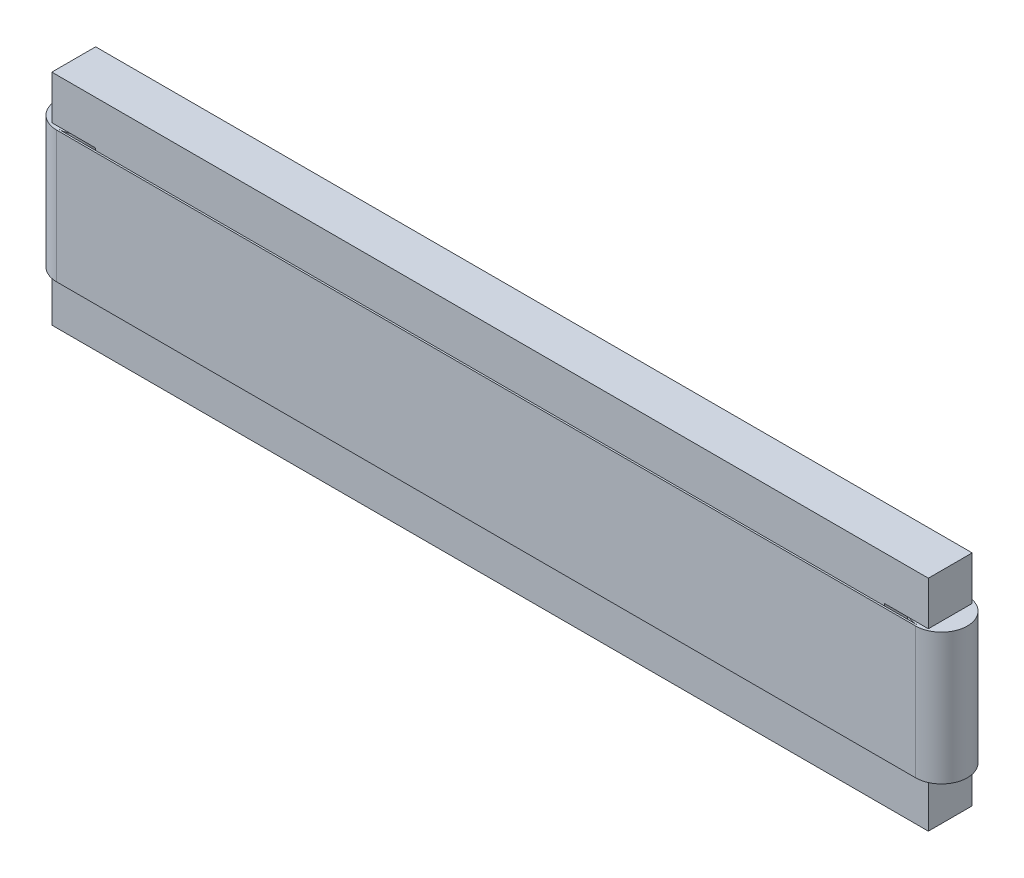
ISO-10303-21;
HEADER;
FILE_DESCRIPTION(('STEP AP214'),'2;1');
FILE_NAME('part.step','',(''),(''),'','','');
FILE_SCHEMA(('AUTOMOTIVE_DESIGN { 1 0 10303 214 1 1 1 1 }'));
ENDSEC;
DATA;
#1=APPLICATION_CONTEXT('core data for automotive mechanical design processes');
#2=APPLICATION_PROTOCOL_DEFINITION('international standard','automotive_design',2000,#1);
#3=PRODUCT_CONTEXT('',#1,'mechanical');
#4=PRODUCT('Part','Part','',(#3));
#5=PRODUCT_RELATED_PRODUCT_CATEGORY('part','',(#4));
#6=PRODUCT_DEFINITION_FORMATION('','',#4);
#7=PRODUCT_DEFINITION_CONTEXT('part definition',#1,'design');
#8=PRODUCT_DEFINITION('design','',#6,#7);
#9=PRODUCT_DEFINITION_SHAPE('','',#8);
#10=(LENGTH_UNIT() NAMED_UNIT(*) SI_UNIT(.MILLI.,.METRE.));
#11=(NAMED_UNIT(*) PLANE_ANGLE_UNIT() SI_UNIT($,.RADIAN.));
#12=(NAMED_UNIT(*) SI_UNIT($,.STERADIAN.) SOLID_ANGLE_UNIT());
#13=UNCERTAINTY_MEASURE_WITH_UNIT(LENGTH_MEASURE(1.E-05),#10,'distance_accuracy_value','');
#14=(GEOMETRIC_REPRESENTATION_CONTEXT(3) GLOBAL_UNCERTAINTY_ASSIGNED_CONTEXT((#13)) GLOBAL_UNIT_ASSIGNED_CONTEXT((#10,
#11,#12)) REPRESENTATION_CONTEXT('',''));
#15=CARTESIAN_POINT('',(0.,0.,0.));
#16=DIRECTION('',(0.,0.,1.));
#17=DIRECTION('',(1.,0.,0.));
#18=AXIS2_PLACEMENT_3D('',#15,#16,#17);
#19=CARTESIAN_POINT('',(-490.,50.0000000000004,25.));
#20=DIRECTION('',(0.,1.,0.));
#21=DIRECTION('',(-1.,0.,0.));
#22=AXIS2_PLACEMENT_3D('',#19,#20,#21);
#23=CYLINDRICAL_SURFACE('',#22,27.5);
#24=DIRECTION('',(0.,-1.,0.));
#25=VECTOR('',#24,1.);
#26=CARTESIAN_POINT('',(-490.,200.,52.5));
#27=LINE('',#26,#25);
#28=CARTESIAN_POINT('',(-490.,200.,52.5));
#29=VERTEX_POINT('',#28);
#30=CARTESIAN_POINT('',(-490.,50.0000000000004,52.5));
#31=VERTEX_POINT('',#30);
#32=EDGE_CURVE('E62',#29,#31,#27,.T.);
#33=ORIENTED_EDGE('',*,*,#32,.T.);
#34=CARTESIAN_POINT('',(-490.,50.0000000000004,25.));
#35=DIRECTION('',(0.,-1.,0.));
#36=DIRECTION('',(1.,0.,0.));
#37=AXIS2_PLACEMENT_3D('',#34,#35,#36);
#38=CIRCLE('',#37,27.5);
#39=CARTESIAN_POINT('',(-478.54356076261,49.9999999999999,50.));
#40=VERTEX_POINT('',#39);
#41=EDGE_CURVE('E304',#40,#31,#38,.T.);
#42=ORIENTED_EDGE('',*,*,#41,.F.);
#43=CARTESIAN_POINT('',(-478.54356076261,49.9999999999999,0.));
#44=VERTEX_POINT('',#43);
#45=EDGE_CURVE('E307',#44,#40,#38,.T.);
#46=ORIENTED_EDGE('',*,*,#45,.F.);
#47=CARTESIAN_POINT('',(-490.,50.0000000000004,-2.50000000000003));
#48=VERTEX_POINT('',#47);
#49=EDGE_CURVE('E55',#48,#44,#38,.T.);
#50=ORIENTED_EDGE('',*,*,#49,.F.);
#51=DIRECTION('',(0.,-1.,0.));
#52=VECTOR('',#51,1.);
#53=CARTESIAN_POINT('',(-490.,200.,-2.50000000000003));
#54=LINE('',#53,#52);
#55=CARTESIAN_POINT('',(-490.,200.,-2.50000000000003));
#56=VERTEX_POINT('',#55);
#57=EDGE_CURVE('E215',#56,#48,#54,.T.);
#58=ORIENTED_EDGE('',*,*,#57,.F.);
#59=CARTESIAN_POINT('',(-490.,200.,25.));
#60=DIRECTION('',(0.,-1.,0.));
#61=DIRECTION('',(1.,0.,0.));
#62=AXIS2_PLACEMENT_3D('',#59,#60,#61);
#63=CIRCLE('',#62,27.5);
#64=CARTESIAN_POINT('',(-478.54356076261,200.,0.));
#65=VERTEX_POINT('',#64);
#66=EDGE_CURVE('E201',#56,#65,#63,.T.);
#67=ORIENTED_EDGE('',*,*,#66,.T.);
#68=CARTESIAN_POINT('',(-478.54356076261,200.,50.));
#69=VERTEX_POINT('',#68);
#70=EDGE_CURVE('E213',#65,#69,#63,.T.);
#71=ORIENTED_EDGE('',*,*,#70,.T.);
#72=EDGE_CURVE('E212',#69,#29,#63,.T.);
#73=ORIENTED_EDGE('',*,*,#72,.T.);
#74=EDGE_LOOP('',(#33,#42,#46,#50,#58,#67,#71,#73));
#75=FACE_BOUND('',#74,.T.);
#76=ADVANCED_FACE('F39',(#75),#23,.T.);
#77=CARTESIAN_POINT('',(-500.,250.,50.));
#78=DIRECTION('',(1.,0.,0.));
#79=DIRECTION('',(0.,0.,-1.));
#80=AXIS2_PLACEMENT_3D('',#77,#78,#79);
#81=PLANE('',#80);
#82=DIRECTION('',(0.,-1.,0.));
#83=VECTOR('',#82,1.);
#84=CARTESIAN_POINT('',(-500.,250.,0.));
#85=LINE('',#84,#83);
#86=CARTESIAN_POINT('',(-500.,250.,0.));
#87=VERTEX_POINT('',#86);
#88=CARTESIAN_POINT('',(-500.,200.,0.));
#89=VERTEX_POINT('',#88);
#90=EDGE_CURVE('E313',#87,#89,#85,.T.);
#91=ORIENTED_EDGE('',*,*,#90,.T.);
#92=DIRECTION('',(0.,0.,-1.));
#93=VECTOR('',#92,1.);
#94=CARTESIAN_POINT('',(-500.,200.,50.));
#95=LINE('',#94,#93);
#96=CARTESIAN_POINT('',(-500.,200.,50.));
#97=VERTEX_POINT('',#96);
#98=EDGE_CURVE('E11',#97,#89,#95,.T.);
#99=ORIENTED_EDGE('',*,*,#98,.F.);
#100=DIRECTION('',(0.,-1.,0.));
#101=VECTOR('',#100,1.);
#102=CARTESIAN_POINT('',(-500.,250.,50.));
#103=LINE('',#102,#101);
#104=CARTESIAN_POINT('',(-500.,250.,50.));
#105=VERTEX_POINT('',#104);
#106=EDGE_CURVE('E314',#105,#97,#103,.T.);
#107=ORIENTED_EDGE('',*,*,#106,.F.);
#108=DIRECTION('',(0.,0.,-1.));
#109=VECTOR('',#108,1.);
#110=CARTESIAN_POINT('',(-500.,250.,50.));
#111=LINE('',#110,#109);
#112=EDGE_CURVE('E357',#105,#87,#111,.T.);
#113=ORIENTED_EDGE('',*,*,#112,.T.);
#114=EDGE_LOOP('',(#91,#99,#107,#113));
#115=FACE_BOUND('',#114,.T.);
#116=ADVANCED_FACE('F41',(#115),#81,.F.);
#117=CARTESIAN_POINT('',(-500.,200.,50.));
#118=DIRECTION('',(0.,1.,0.));
#119=DIRECTION('',(0.,0.,1.));
#120=AXIS2_PLACEMENT_3D('',#117,#118,#119);
#121=PLANE('',#120);
#122=ORIENTED_EDGE('',*,*,#70,.F.);
#123=DIRECTION('',(1.,0.,0.));
#124=VECTOR('',#123,1.);
#125=CARTESIAN_POINT('',(-500.,200.,0.));
#126=LINE('',#125,#124);
#127=CARTESIAN_POINT('',(-450.,200.,0.));
#128=VERTEX_POINT('',#127);
#129=EDGE_CURVE('E361',#65,#128,#126,.T.);
#130=ORIENTED_EDGE('',*,*,#129,.T.);
#131=DIRECTION('',(0.,0.,-1.));
#132=VECTOR('',#131,1.);
#133=CARTESIAN_POINT('',(-450.,200.,50.));
#134=LINE('',#133,#132);
#135=CARTESIAN_POINT('',(-450.,200.,50.));
#136=VERTEX_POINT('',#135);
#137=EDGE_CURVE('E48',#136,#128,#134,.T.);
#138=ORIENTED_EDGE('',*,*,#137,.F.);
#139=DIRECTION('',(1.,0.,0.));
#140=VECTOR('',#139,1.);
#141=CARTESIAN_POINT('',(-500.,200.,50.));
#142=LINE('',#141,#140);
#143=EDGE_CURVE('E317',#69,#136,#142,.T.);
#144=ORIENTED_EDGE('',*,*,#143,.F.);
#145=EDGE_LOOP('',(#122,#130,#138,#144));
#146=FACE_BOUND('',#145,.T.);
#147=ADVANCED_FACE('F529',(#146),#121,.F.);
#148=CARTESIAN_POINT('',(-450.,49.9999999999999,50.));
#149=DIRECTION('',(1.,0.,0.));
#150=DIRECTION('',(0.,0.,-1.));
#151=AXIS2_PLACEMENT_3D('',#148,#149,#150);
#152=PLANE('',#151);
#153=DIRECTION('',(0.,-1.,0.));
#154=VECTOR('',#153,1.);
#155=CARTESIAN_POINT('',(-450.,49.9999999999999,0.));
#156=LINE('',#155,#154);
#157=CARTESIAN_POINT('',(-450.,49.9999999999999,0.));
#158=VERTEX_POINT('',#157);
#159=EDGE_CURVE('E364',#128,#158,#156,.T.);
#160=ORIENTED_EDGE('',*,*,#159,.T.);
#161=DIRECTION('',(0.,0.,-1.));
#162=VECTOR('',#161,1.);
#163=CARTESIAN_POINT('',(-450.,49.9999999999999,50.));
#164=LINE('',#163,#162);
#165=CARTESIAN_POINT('',(-450.,49.9999999999999,50.));
#166=VERTEX_POINT('',#165);
#167=EDGE_CURVE('E434',#166,#158,#164,.T.);
#168=ORIENTED_EDGE('',*,*,#167,.F.);
#169=DIRECTION('',(0.,-1.,0.));
#170=VECTOR('',#169,1.);
#171=CARTESIAN_POINT('',(-450.,49.9999999999999,50.));
#172=LINE('',#171,#170);
#173=EDGE_CURVE('E323',#136,#166,#172,.T.);
#174=ORIENTED_EDGE('',*,*,#173,.F.);
#175=ORIENTED_EDGE('',*,*,#137,.T.);
#176=EDGE_LOOP('',(#160,#168,#174,#175));
#177=FACE_BOUND('',#176,.T.);
#178=ADVANCED_FACE('F443',(#177),#152,.F.);
#179=CARTESIAN_POINT('',(-500.,49.9999999999999,50.));
#180=DIRECTION('',(0.,-1.,0.));
#181=DIRECTION('',(0.,0.,-1.));
#182=AXIS2_PLACEMENT_3D('',#179,#180,#181);
#183=PLANE('',#182);
#184=ORIENTED_EDGE('',*,*,#45,.T.);
#185=DIRECTION('',(-1.,0.,0.));
#186=VECTOR('',#185,1.);
#187=CARTESIAN_POINT('',(-500.,49.9999999999999,50.));
#188=LINE('',#187,#186);
#189=EDGE_CURVE('E326',#166,#40,#188,.T.);
#190=ORIENTED_EDGE('',*,*,#189,.F.);
#191=ORIENTED_EDGE('',*,*,#167,.T.);
#192=DIRECTION('',(-1.,0.,0.));
#193=VECTOR('',#192,1.);
#194=CARTESIAN_POINT('',(-500.,49.9999999999999,0.));
#195=LINE('',#194,#193);
#196=EDGE_CURVE('E368',#158,#44,#195,.T.);
#197=ORIENTED_EDGE('',*,*,#196,.T.);
#198=EDGE_LOOP('',(#184,#190,#191,#197));
#199=FACE_BOUND('',#198,.T.);
#200=ADVANCED_FACE('F454',(#199),#183,.F.);
#201=CARTESIAN_POINT('',(-500.,-1.52655665885959E-13,50.));
#202=DIRECTION('',(1.,0.,0.));
#203=DIRECTION('',(0.,1.,0.));
#204=AXIS2_PLACEMENT_3D('',#201,#202,#203);
#205=PLANE('',#204);
#206=DIRECTION('',(0.,-1.,0.));
#207=VECTOR('',#206,1.);
#208=CARTESIAN_POINT('',(-500.,-1.52655665885959E-13,0.));
#209=LINE('',#208,#207);
#210=CARTESIAN_POINT('',(-500.,50.0000000000004,0.));
#211=VERTEX_POINT('',#210);
#212=CARTESIAN_POINT('',(-500.,-1.52655665885959E-13,0.));
#213=VERTEX_POINT('',#212);
#214=EDGE_CURVE('E372',#211,#213,#209,.T.);
#215=ORIENTED_EDGE('',*,*,#214,.T.);
#216=DIRECTION('',(0.,0.,-1.));
#217=VECTOR('',#216,1.);
#218=CARTESIAN_POINT('',(-500.,-1.52655665885959E-13,50.));
#219=LINE('',#218,#217);
#220=CARTESIAN_POINT('',(-500.,-1.52655665885959E-13,50.));
#221=VERTEX_POINT('',#220);
#222=EDGE_CURVE('E426',#221,#213,#219,.T.);
#223=ORIENTED_EDGE('',*,*,#222,.F.);
#224=DIRECTION('',(0.,-1.,0.));
#225=VECTOR('',#224,1.);
#226=CARTESIAN_POINT('',(-500.,-1.52655665885959E-13,50.));
#227=LINE('',#226,#225);
#228=CARTESIAN_POINT('',(-500.,49.9999999999999,50.));
#229=VERTEX_POINT('',#228);
#230=EDGE_CURVE('E330',#229,#221,#227,.T.);
#231=ORIENTED_EDGE('',*,*,#230,.F.);
#232=DIRECTION('',(0.,0.,-1.));
#233=VECTOR('',#232,1.);
#234=CARTESIAN_POINT('',(-500.,49.9999999999999,50.));
#235=LINE('',#234,#233);
#236=EDGE_CURVE('E430',#229,#211,#235,.T.);
#237=ORIENTED_EDGE('',*,*,#236,.T.);
#238=EDGE_LOOP('',(#215,#223,#231,#237));
#239=FACE_BOUND('',#238,.T.);
#240=ADVANCED_FACE('F493',(#239),#205,.F.);
#241=CARTESIAN_POINT('',(500.,1.52655665885959E-13,50.));
#242=DIRECTION('',(0.,1.,0.));
#243=DIRECTION('',(-1.,0.,0.));
#244=AXIS2_PLACEMENT_3D('',#241,#242,#243);
#245=PLANE('',#244);
#246=DIRECTION('',(1.,0.,0.));
#247=VECTOR('',#246,1.);
#248=CARTESIAN_POINT('',(500.,1.52655665885959E-13,0.));
#249=LINE('',#248,#247);
#250=CARTESIAN_POINT('',(500.,1.52655665885959E-13,0.));
#251=VERTEX_POINT('',#250);
#252=EDGE_CURVE('E375',#213,#251,#249,.T.);
#253=ORIENTED_EDGE('',*,*,#252,.T.);
#254=DIRECTION('',(0.,0.,-1.));
#255=VECTOR('',#254,1.);
#256=CARTESIAN_POINT('',(500.,1.52655665885959E-13,50.));
#257=LINE('',#256,#255);
#258=CARTESIAN_POINT('',(500.,1.52655665885959E-13,50.));
#259=VERTEX_POINT('',#258);
#260=EDGE_CURVE('E422',#259,#251,#257,.T.);
#261=ORIENTED_EDGE('',*,*,#260,.F.);
#262=DIRECTION('',(1.,0.,0.));
#263=VECTOR('',#262,1.);
#264=CARTESIAN_POINT('',(500.,1.52655665885959E-13,50.));
#265=LINE('',#264,#263);
#266=EDGE_CURVE('E333',#221,#259,#265,.T.);
#267=ORIENTED_EDGE('',*,*,#266,.F.);
#268=ORIENTED_EDGE('',*,*,#222,.T.);
#269=EDGE_LOOP('',(#253,#261,#267,#268));
#270=FACE_BOUND('',#269,.T.);
#271=ADVANCED_FACE('F498',(#270),#245,.F.);
#272=CARTESIAN_POINT('',(500.,50.,50.));
#273=DIRECTION('',(-1.,0.,0.));
#274=DIRECTION('',(0.,0.,1.));
#275=AXIS2_PLACEMENT_3D('',#272,#273,#274);
#276=PLANE('',#275);
#277=DIRECTION('',(0.,1.,0.));
#278=VECTOR('',#277,1.);
#279=CARTESIAN_POINT('',(500.,50.,0.));
#280=LINE('',#279,#278);
#281=CARTESIAN_POINT('',(500.,50.,0.));
#282=VERTEX_POINT('',#281);
#283=EDGE_CURVE('E378',#251,#282,#280,.T.);
#284=ORIENTED_EDGE('',*,*,#283,.T.);
#285=DIRECTION('',(0.,0.,-1.));
#286=VECTOR('',#285,1.);
#287=CARTESIAN_POINT('',(500.,50.,50.));
#288=LINE('',#287,#286);
#289=CARTESIAN_POINT('',(500.,50.,50.));
#290=VERTEX_POINT('',#289);
#291=EDGE_CURVE('E418',#290,#282,#288,.T.);
#292=ORIENTED_EDGE('',*,*,#291,.F.);
#293=DIRECTION('',(0.,1.,0.));
#294=VECTOR('',#293,1.);
#295=CARTESIAN_POINT('',(500.,50.,50.));
#296=LINE('',#295,#294);
#297=EDGE_CURVE('E336',#259,#290,#296,.T.);
#298=ORIENTED_EDGE('',*,*,#297,.F.);
#299=ORIENTED_EDGE('',*,*,#260,.T.);
#300=EDGE_LOOP('',(#284,#292,#298,#299));
#301=FACE_BOUND('',#300,.T.);
#302=ADVANCED_FACE('F502',(#301),#276,.F.);
#303=CARTESIAN_POINT('',(450.,50.,50.));
#304=DIRECTION('',(0.,-1.,0.));
#305=DIRECTION('',(1.,0.,0.));
#306=AXIS2_PLACEMENT_3D('',#303,#304,#305);
#307=PLANE('',#306);
#308=DIRECTION('',(-1.,0.,0.));
#309=VECTOR('',#308,1.);
#310=CARTESIAN_POINT('',(450.,50.,50.));
#311=LINE('',#310,#309);
#312=CARTESIAN_POINT('',(478.54356076261,50.,50.));
#313=VERTEX_POINT('',#312);
#314=CARTESIAN_POINT('',(450.,50.,50.));
#315=VERTEX_POINT('',#314);
#316=EDGE_CURVE('E339',#313,#315,#311,.T.);
#317=ORIENTED_EDGE('',*,*,#316,.F.);
#318=CARTESIAN_POINT('',(490.,50.0000000000004,25.));
#319=DIRECTION('',(0.,1.,0.));
#320=DIRECTION('',(-1.,0.,0.));
#321=AXIS2_PLACEMENT_3D('',#318,#319,#320);
#322=CIRCLE('',#321,27.5);
#323=CARTESIAN_POINT('',(478.54356076261,50.0000000000004,0.));
#324=VERTEX_POINT('',#323);
#325=EDGE_CURVE('E296',#324,#313,#322,.T.);
#326=ORIENTED_EDGE('',*,*,#325,.F.);
#327=DIRECTION('',(-1.,0.,0.));
#328=VECTOR('',#327,1.);
#329=CARTESIAN_POINT('',(450.,50.,0.));
#330=LINE('',#329,#328);
#331=CARTESIAN_POINT('',(450.,50.,0.));
#332=VERTEX_POINT('',#331);
#333=EDGE_CURVE('E381',#324,#332,#330,.T.);
#334=ORIENTED_EDGE('',*,*,#333,.T.);
#335=DIRECTION('',(0.,0.,-1.));
#336=VECTOR('',#335,1.);
#337=CARTESIAN_POINT('',(450.,50.,50.));
#338=LINE('',#337,#336);
#339=EDGE_CURVE('E414',#315,#332,#338,.T.);
#340=ORIENTED_EDGE('',*,*,#339,.F.);
#341=EDGE_LOOP('',(#317,#326,#334,#340));
#342=FACE_BOUND('',#341,.T.);
#343=ADVANCED_FACE('F510',(#342),#307,.F.);
#344=CARTESIAN_POINT('',(450.,200.,50.));
#345=DIRECTION('',(-1.,0.,0.));
#346=DIRECTION('',(0.,-1.,0.));
#347=AXIS2_PLACEMENT_3D('',#344,#345,#346);
#348=PLANE('',#347);
#349=DIRECTION('',(0.,1.,0.));
#350=VECTOR('',#349,1.);
#351=CARTESIAN_POINT('',(450.,200.,0.));
#352=LINE('',#351,#350);
#353=CARTESIAN_POINT('',(450.,200.,0.));
#354=VERTEX_POINT('',#353);
#355=EDGE_CURVE('E386',#332,#354,#352,.T.);
#356=ORIENTED_EDGE('',*,*,#355,.T.);
#357=DIRECTION('',(0.,0.,-1.));
#358=VECTOR('',#357,1.);
#359=CARTESIAN_POINT('',(450.,200.,50.));
#360=LINE('',#359,#358);
#361=CARTESIAN_POINT('',(450.,200.,50.));
#362=VERTEX_POINT('',#361);
#363=EDGE_CURVE('E410',#362,#354,#360,.T.);
#364=ORIENTED_EDGE('',*,*,#363,.F.);
#365=DIRECTION('',(0.,1.,0.));
#366=VECTOR('',#365,1.);
#367=CARTESIAN_POINT('',(450.,200.,50.));
#368=LINE('',#367,#366);
#369=EDGE_CURVE('E344',#315,#362,#368,.T.);
#370=ORIENTED_EDGE('',*,*,#369,.F.);
#371=ORIENTED_EDGE('',*,*,#339,.T.);
#372=EDGE_LOOP('',(#356,#364,#370,#371));
#373=FACE_BOUND('',#372,.T.);
#374=ADVANCED_FACE('F553',(#373),#348,.F.);
#375=CARTESIAN_POINT('',(500.,200.,50.));
#376=DIRECTION('',(0.,1.,0.));
#377=DIRECTION('',(0.,0.,1.));
#378=AXIS2_PLACEMENT_3D('',#375,#376,#377);
#379=PLANE('',#378);
#380=DIRECTION('',(1.,0.,0.));
#381=VECTOR('',#380,1.);
#382=CARTESIAN_POINT('',(500.,200.,0.));
#383=LINE('',#382,#381);
#384=CARTESIAN_POINT('',(478.54356076261,200.,0.));
#385=VERTEX_POINT('',#384);
#386=EDGE_CURVE('E390',#354,#385,#383,.T.);
#387=ORIENTED_EDGE('',*,*,#386,.T.);
#388=CARTESIAN_POINT('',(490.,200.,25.));
#389=DIRECTION('',(0.,1.,0.));
#390=DIRECTION('',(-1.,0.,0.));
#391=AXIS2_PLACEMENT_3D('',#388,#389,#390);
#392=CIRCLE('',#391,27.5);
#393=CARTESIAN_POINT('',(478.54356076261,200.,50.));
#394=VERTEX_POINT('',#393);
#395=EDGE_CURVE('E281',#385,#394,#392,.T.);
#396=ORIENTED_EDGE('',*,*,#395,.T.);
#397=DIRECTION('',(1.,0.,0.));
#398=VECTOR('',#397,1.);
#399=CARTESIAN_POINT('',(500.,200.,50.));
#400=LINE('',#399,#398);
#401=EDGE_CURVE('E347',#362,#394,#400,.T.);
#402=ORIENTED_EDGE('',*,*,#401,.F.);
#403=ORIENTED_EDGE('',*,*,#363,.T.);
#404=EDGE_LOOP('',(#387,#396,#402,#403));
#405=FACE_BOUND('',#404,.T.);
#406=ADVANCED_FACE('F476',(#405),#379,.F.);
#407=CARTESIAN_POINT('',(500.,250.,50.));
#408=DIRECTION('',(-1.,0.,0.));
#409=DIRECTION('',(0.,0.,1.));
#410=AXIS2_PLACEMENT_3D('',#407,#408,#409);
#411=PLANE('',#410);
#412=DIRECTION('',(0.,1.,0.));
#413=VECTOR('',#412,1.);
#414=CARTESIAN_POINT('',(500.,250.,0.));
#415=LINE('',#414,#413);
#416=CARTESIAN_POINT('',(500.,200.,0.));
#417=VERTEX_POINT('',#416);
#418=CARTESIAN_POINT('',(500.,250.,0.));
#419=VERTEX_POINT('',#418);
#420=EDGE_CURVE('E394',#417,#419,#415,.T.);
#421=ORIENTED_EDGE('',*,*,#420,.T.);
#422=DIRECTION('',(0.,0.,-1.));
#423=VECTOR('',#422,1.);
#424=CARTESIAN_POINT('',(500.,250.,50.));
#425=LINE('',#424,#423);
#426=CARTESIAN_POINT('',(500.,250.,50.));
#427=VERTEX_POINT('',#426);
#428=EDGE_CURVE('E402',#427,#419,#425,.T.);
#429=ORIENTED_EDGE('',*,*,#428,.F.);
#430=DIRECTION('',(0.,1.,0.));
#431=VECTOR('',#430,1.);
#432=CARTESIAN_POINT('',(500.,250.,50.));
#433=LINE('',#432,#431);
#434=CARTESIAN_POINT('',(500.,200.,50.));
#435=VERTEX_POINT('',#434);
#436=EDGE_CURVE('E351',#435,#427,#433,.T.);
#437=ORIENTED_EDGE('',*,*,#436,.F.);
#438=DIRECTION('',(0.,0.,-1.));
#439=VECTOR('',#438,1.);
#440=CARTESIAN_POINT('',(500.,200.,50.));
#441=LINE('',#440,#439);
#442=EDGE_CURVE('E406',#435,#417,#441,.T.);
#443=ORIENTED_EDGE('',*,*,#442,.T.);
#444=EDGE_LOOP('',(#421,#429,#437,#443));
#445=FACE_BOUND('',#444,.T.);
#446=ADVANCED_FACE('F525',(#445),#411,.F.);
#447=CARTESIAN_POINT('',(-500.,250.,50.));
#448=DIRECTION('',(0.,-1.,0.));
#449=DIRECTION('',(0.,0.,-1.));
#450=AXIS2_PLACEMENT_3D('',#447,#448,#449);
#451=PLANE('',#450);
#452=DIRECTION('',(-1.,0.,0.));
#453=VECTOR('',#452,1.);
#454=CARTESIAN_POINT('',(-500.,250.,0.));
#455=LINE('',#454,#453);
#456=EDGE_CURVE('E318',#419,#87,#455,.T.);
#457=ORIENTED_EDGE('',*,*,#456,.T.);
#458=ORIENTED_EDGE('',*,*,#112,.F.);
#459=DIRECTION('',(-1.,0.,0.));
#460=VECTOR('',#459,1.);
#461=CARTESIAN_POINT('',(-500.,250.,50.));
#462=LINE('',#461,#460);
#463=EDGE_CURVE('E354',#427,#105,#462,.T.);
#464=ORIENTED_EDGE('',*,*,#463,.F.);
#465=ORIENTED_EDGE('',*,*,#428,.T.);
#466=EDGE_LOOP('',(#457,#458,#464,#465));
#467=FACE_BOUND('',#466,.T.);
#468=ADVANCED_FACE('F522',(#467),#451,.F.);
#469=CARTESIAN_POINT('',(0.,0.,50.));
#470=DIRECTION('',(0.,0.,1.));
#471=DIRECTION('',(1.,0.,0.));
#472=AXIS2_PLACEMENT_3D('',#469,#470,#471);
#473=PLANE('',#472);
#474=ORIENTED_EDGE('',*,*,#106,.T.);
#475=EDGE_CURVE('E319',#97,#69,#142,.T.);
#476=ORIENTED_EDGE('',*,*,#475,.T.);
#477=ORIENTED_EDGE('',*,*,#143,.T.);
#478=ORIENTED_EDGE('',*,*,#173,.T.);
#479=ORIENTED_EDGE('',*,*,#189,.T.);
#480=DIRECTION('',(1.,0.,0.));
#481=VECTOR('',#480,1.);
#482=CARTESIAN_POINT('',(0.,49.9999999999999,50.));
#483=LINE('',#482,#481);
#484=EDGE_CURVE('E306',#229,#40,#483,.T.);
#485=ORIENTED_EDGE('',*,*,#484,.F.);
#486=ORIENTED_EDGE('',*,*,#230,.T.);
#487=ORIENTED_EDGE('',*,*,#266,.T.);
#488=ORIENTED_EDGE('',*,*,#297,.T.);
#489=EDGE_CURVE('E340',#290,#313,#311,.T.);
#490=ORIENTED_EDGE('',*,*,#489,.T.);
#491=ORIENTED_EDGE('',*,*,#316,.T.);
#492=ORIENTED_EDGE('',*,*,#369,.T.);
#493=ORIENTED_EDGE('',*,*,#401,.T.);
#494=DIRECTION('',(1.,0.,0.));
#495=VECTOR('',#494,1.);
#496=CARTESIAN_POINT('',(-2.22044604925031E-13,200.,50.));
#497=LINE('',#496,#495);
#498=EDGE_CURVE('E294',#394,#435,#497,.T.);
#499=ORIENTED_EDGE('',*,*,#498,.T.);
#500=ORIENTED_EDGE('',*,*,#436,.T.);
#501=ORIENTED_EDGE('',*,*,#463,.T.);
#502=EDGE_LOOP('',(#474,#476,#477,#478,#479,#485,#486,#487,#488,#490,#491,#492,#493,#499,#500,#501));
#503=FACE_BOUND('',#502,.T.);
#504=ADVANCED_FACE('F480',(#503),#473,.T.);
#505=CARTESIAN_POINT('',(0.,0.,0.));
#506=DIRECTION('',(0.,0.,1.));
#507=DIRECTION('',(1.,0.,0.));
#508=AXIS2_PLACEMENT_3D('',#505,#506,#507);
#509=PLANE('',#508);
#510=ORIENTED_EDGE('',*,*,#90,.F.);
#511=ORIENTED_EDGE('',*,*,#456,.F.);
#512=ORIENTED_EDGE('',*,*,#420,.F.);
#513=EDGE_CURVE('E389',#385,#417,#383,.T.);
#514=ORIENTED_EDGE('',*,*,#513,.F.);
#515=ORIENTED_EDGE('',*,*,#386,.F.);
#516=ORIENTED_EDGE('',*,*,#355,.F.);
#517=ORIENTED_EDGE('',*,*,#333,.F.);
#518=EDGE_CURVE('E382',#282,#324,#330,.T.);
#519=ORIENTED_EDGE('',*,*,#518,.F.);
#520=ORIENTED_EDGE('',*,*,#283,.F.);
#521=ORIENTED_EDGE('',*,*,#252,.F.);
#522=ORIENTED_EDGE('',*,*,#214,.F.);
#523=EDGE_CURVE('E367',#44,#211,#195,.T.);
#524=ORIENTED_EDGE('',*,*,#523,.F.);
#525=ORIENTED_EDGE('',*,*,#196,.F.);
#526=ORIENTED_EDGE('',*,*,#159,.F.);
#527=ORIENTED_EDGE('',*,*,#129,.F.);
#528=EDGE_CURVE('E208',#89,#65,#126,.T.);
#529=ORIENTED_EDGE('',*,*,#528,.F.);
#530=EDGE_LOOP('',(#510,#511,#512,#514,#515,#516,#517,#519,#520,#521,#522,#524,#525,#526,#527,#529));
#531=FACE_BOUND('',#530,.T.);
#532=ADVANCED_FACE('F449',(#531),#509,.F.);
#533=CARTESIAN_POINT('',(-490.,50.0000000000004,25.));
#534=DIRECTION('',(0.,-1.,0.));
#535=DIRECTION('',(1.,0.,0.));
#536=AXIS2_PLACEMENT_3D('',#533,#534,#535);
#537=PLANE('',#536);
#538=ORIENTED_EDGE('',*,*,#236,.F.);
#539=ORIENTED_EDGE('',*,*,#484,.T.);
#540=ORIENTED_EDGE('',*,*,#41,.T.);
#541=DIRECTION('',(-1.,0.,0.));
#542=VECTOR('',#541,1.);
#543=CARTESIAN_POINT('',(-490.,50.0000000000004,52.5));
#544=LINE('',#543,#542);
#545=CARTESIAN_POINT('',(490.,49.9999999999994,52.5));
#546=VERTEX_POINT('',#545);
#547=EDGE_CURVE('E226',#546,#31,#544,.T.);
#548=ORIENTED_EDGE('',*,*,#547,.F.);
#549=EDGE_CURVE('E290',#313,#546,#322,.T.);
#550=ORIENTED_EDGE('',*,*,#549,.F.);
#551=ORIENTED_EDGE('',*,*,#489,.F.);
#552=ORIENTED_EDGE('',*,*,#291,.T.);
#553=ORIENTED_EDGE('',*,*,#518,.T.);
#554=CARTESIAN_POINT('',(490.,49.9999999999994,-2.49999999999997));
#555=VERTEX_POINT('',#554);
#556=EDGE_CURVE('E295',#555,#324,#322,.T.);
#557=ORIENTED_EDGE('',*,*,#556,.F.);
#558=DIRECTION('',(1.,0.,0.));
#559=VECTOR('',#558,1.);
#560=CARTESIAN_POINT('',(490.,49.9999999999994,-2.49999999999997));
#561=LINE('',#560,#559);
#562=EDGE_CURVE('E233',#48,#555,#561,.T.);
#563=ORIENTED_EDGE('',*,*,#562,.F.);
#564=ORIENTED_EDGE('',*,*,#49,.T.);
#565=ORIENTED_EDGE('',*,*,#523,.T.);
#566=EDGE_LOOP('',(#538,#539,#540,#548,#550,#551,#552,#553,#557,#563,#564,#565));
#567=FACE_BOUND('',#566,.T.);
#568=CARTESIAN_POINT('',(-490.,50.0000000000004,25.));
#569=DIRECTION('',(0.,-1.,0.));
#570=DIRECTION('',(1.,0.,0.));
#571=AXIS2_PLACEMENT_3D('',#568,#569,#570);
#572=CIRCLE('',#571,29.5);
#573=CARTESIAN_POINT('',(-490.,50.0000000000004,54.5));
#574=VERTEX_POINT('',#573);
#575=CARTESIAN_POINT('',(-490.,50.0000000000004,-4.49999999999997));
#576=VERTEX_POINT('',#575);
#577=EDGE_CURVE('E240',#574,#576,#572,.T.);
#578=ORIENTED_EDGE('',*,*,#577,.T.);
#579=DIRECTION('',(1.,0.,0.));
#580=VECTOR('',#579,1.);
#581=CARTESIAN_POINT('',(490.,49.9999999999994,-4.49999999999998));
#582=LINE('',#581,#580);
#583=CARTESIAN_POINT('',(490.,49.9999999999994,-4.5));
#584=VERTEX_POINT('',#583);
#585=EDGE_CURVE('E267',#576,#584,#582,.T.);
#586=ORIENTED_EDGE('',*,*,#585,.T.);
#587=CARTESIAN_POINT('',(490.,49.9999999999994,25.));
#588=DIRECTION('',(0.,-1.,0.));
#589=DIRECTION('',(1.,0.,0.));
#590=AXIS2_PLACEMENT_3D('',#587,#588,#589);
#591=CIRCLE('',#590,29.5);
#592=CARTESIAN_POINT('',(490.,49.9999999999994,54.5));
#593=VERTEX_POINT('',#592);
#594=EDGE_CURVE('E271',#584,#593,#591,.T.);
#595=ORIENTED_EDGE('',*,*,#594,.T.);
#596=DIRECTION('',(-1.,0.,0.));
#597=VECTOR('',#596,1.);
#598=CARTESIAN_POINT('',(-490.,50.0000000000004,54.5));
#599=LINE('',#598,#597);
#600=EDGE_CURVE('E251',#593,#574,#599,.T.);
#601=ORIENTED_EDGE('',*,*,#600,.T.);
#602=EDGE_LOOP('',(#578,#586,#595,#601));
#603=FACE_BOUND('',#602,.T.);
#604=ADVANCED_FACE('F460',(#567,#603),#537,.T.);
#605=CARTESIAN_POINT('',(-490.,200.,25.));
#606=DIRECTION('',(0.,-1.,0.));
#607=DIRECTION('',(1.,0.,0.));
#608=AXIS2_PLACEMENT_3D('',#605,#606,#607);
#609=PLANE('',#608);
#610=ORIENTED_EDGE('',*,*,#475,.F.);
#611=ORIENTED_EDGE('',*,*,#98,.T.);
#612=ORIENTED_EDGE('',*,*,#528,.T.);
#613=ORIENTED_EDGE('',*,*,#66,.F.);
#614=DIRECTION('',(1.,0.,0.));
#615=VECTOR('',#614,1.);
#616=CARTESIAN_POINT('',(490.,199.999999999999,-2.49999999999997));
#617=LINE('',#616,#615);
#618=CARTESIAN_POINT('',(490.,200.,-2.49999999999997));
#619=VERTEX_POINT('',#618);
#620=EDGE_CURVE('E206',#56,#619,#617,.T.);
#621=ORIENTED_EDGE('',*,*,#620,.T.);
#622=EDGE_CURVE('E301',#619,#385,#392,.T.);
#623=ORIENTED_EDGE('',*,*,#622,.T.);
#624=ORIENTED_EDGE('',*,*,#513,.T.);
#625=ORIENTED_EDGE('',*,*,#442,.F.);
#626=ORIENTED_EDGE('',*,*,#498,.F.);
#627=CARTESIAN_POINT('',(490.,199.999999999999,52.5));
#628=VERTEX_POINT('',#627);
#629=EDGE_CURVE('E297',#394,#628,#392,.T.);
#630=ORIENTED_EDGE('',*,*,#629,.T.);
#631=DIRECTION('',(-1.,0.,0.));
#632=VECTOR('',#631,1.);
#633=CARTESIAN_POINT('',(-490.,200.,52.5));
#634=LINE('',#633,#632);
#635=EDGE_CURVE('E220',#628,#29,#634,.T.);
#636=ORIENTED_EDGE('',*,*,#635,.T.);
#637=ORIENTED_EDGE('',*,*,#72,.F.);
#638=EDGE_LOOP('',(#610,#611,#612,#613,#621,#623,#624,#625,#626,#630,#636,#637));
#639=FACE_BOUND('',#638,.T.);
#640=CARTESIAN_POINT('',(-490.,200.,25.));
#641=DIRECTION('',(0.,-1.,0.));
#642=DIRECTION('',(1.,0.,0.));
#643=AXIS2_PLACEMENT_3D('',#640,#641,#642);
#644=CIRCLE('',#643,29.5);
#645=CARTESIAN_POINT('',(-490.,200.,54.5));
#646=VERTEX_POINT('',#645);
#647=CARTESIAN_POINT('',(-490.,200.,-4.49999999999997));
#648=VERTEX_POINT('',#647);
#649=EDGE_CURVE('E246',#646,#648,#644,.T.);
#650=ORIENTED_EDGE('',*,*,#649,.F.);
#651=DIRECTION('',(-1.,0.,0.));
#652=VECTOR('',#651,1.);
#653=CARTESIAN_POINT('',(-490.,200.,54.5));
#654=LINE('',#653,#652);
#655=CARTESIAN_POINT('',(490.,199.999999999999,54.5));
#656=VERTEX_POINT('',#655);
#657=EDGE_CURVE('E259',#656,#646,#654,.T.);
#658=ORIENTED_EDGE('',*,*,#657,.F.);
#659=CARTESIAN_POINT('',(490.,199.999999999999,25.));
#660=DIRECTION('',(0.,-1.,0.));
#661=DIRECTION('',(1.,0.,0.));
#662=AXIS2_PLACEMENT_3D('',#659,#660,#661);
#663=CIRCLE('',#662,29.5);
#664=CARTESIAN_POINT('',(490.,199.999999999999,-4.5));
#665=VERTEX_POINT('',#664);
#666=EDGE_CURVE('E255',#665,#656,#663,.T.);
#667=ORIENTED_EDGE('',*,*,#666,.F.);
#668=DIRECTION('',(1.,0.,0.));
#669=VECTOR('',#668,1.);
#670=CARTESIAN_POINT('',(490.,199.999999999999,-4.49999999999998));
#671=LINE('',#670,#669);
#672=EDGE_CURVE('E250',#648,#665,#671,.T.);
#673=ORIENTED_EDGE('',*,*,#672,.F.);
#674=EDGE_LOOP('',(#650,#658,#667,#673));
#675=FACE_BOUND('',#674,.T.);
#676=ADVANCED_FACE('F203',(#639,#675),#609,.F.);
#677=CARTESIAN_POINT('',(490.,50.0000000000004,25.));
#678=DIRECTION('',(0.,1.,0.));
#679=DIRECTION('',(-1.,0.,0.));
#680=AXIS2_PLACEMENT_3D('',#677,#678,#679);
#681=CYLINDRICAL_SURFACE('',#680,27.5);
#682=DIRECTION('',(0.,-1.,0.));
#683=VECTOR('',#682,1.);
#684=CARTESIAN_POINT('',(490.,199.999999999999,52.5));
#685=LINE('',#684,#683);
#686=EDGE_CURVE('E241',#628,#546,#685,.T.);
#687=ORIENTED_EDGE('',*,*,#686,.F.);
#688=ORIENTED_EDGE('',*,*,#629,.F.);
#689=ORIENTED_EDGE('',*,*,#395,.F.);
#690=ORIENTED_EDGE('',*,*,#622,.F.);
#691=DIRECTION('',(0.,-1.,0.));
#692=VECTOR('',#691,1.);
#693=CARTESIAN_POINT('',(490.,199.999999999999,-2.49999999999997));
#694=LINE('',#693,#692);
#695=EDGE_CURVE('E219',#619,#555,#694,.T.);
#696=ORIENTED_EDGE('',*,*,#695,.T.);
#697=ORIENTED_EDGE('',*,*,#556,.T.);
#698=ORIENTED_EDGE('',*,*,#325,.T.);
#699=ORIENTED_EDGE('',*,*,#549,.T.);
#700=EDGE_LOOP('',(#687,#688,#689,#690,#696,#697,#698,#699));
#701=FACE_BOUND('',#700,.T.);
#702=ADVANCED_FACE('F465',(#701),#681,.T.);
#703=CARTESIAN_POINT('',(-490.,200.,25.));
#704=DIRECTION('',(0.,-1.,0.));
#705=DIRECTION('',(1.,0.,0.));
#706=AXIS2_PLACEMENT_3D('',#703,#704,#705);
#707=CYLINDRICAL_SURFACE('',#706,29.5);
#708=ORIENTED_EDGE('',*,*,#577,.F.);
#709=DIRECTION('',(0.,-1.,0.));
#710=VECTOR('',#709,1.);
#711=CARTESIAN_POINT('',(-490.,200.,54.5));
#712=LINE('',#711,#710);
#713=EDGE_CURVE('E278',#646,#574,#712,.T.);
#714=ORIENTED_EDGE('',*,*,#713,.F.);
#715=ORIENTED_EDGE('',*,*,#649,.T.);
#716=DIRECTION('',(0.,-1.,0.));
#717=VECTOR('',#716,1.);
#718=CARTESIAN_POINT('',(-490.,200.,-4.49999999999997));
#719=LINE('',#718,#717);
#720=EDGE_CURVE('E263',#648,#576,#719,.T.);
#721=ORIENTED_EDGE('',*,*,#720,.T.);
#722=EDGE_LOOP('',(#708,#714,#715,#721));
#723=FACE_BOUND('',#722,.T.);
#724=ADVANCED_FACE('F627',(#723),#707,.T.);
#725=CARTESIAN_POINT('',(-490.,200.,54.5));
#726=DIRECTION('',(0.,0.,1.));
#727=DIRECTION('',(1.,0.,0.));
#728=AXIS2_PLACEMENT_3D('',#725,#726,#727);
#729=PLANE('',#728);
#730=ORIENTED_EDGE('',*,*,#600,.F.);
#731=DIRECTION('',(0.,-1.,0.));
#732=VECTOR('',#731,1.);
#733=CARTESIAN_POINT('',(490.,199.999999999999,54.5));
#734=LINE('',#733,#732);
#735=EDGE_CURVE('E282',#656,#593,#734,.T.);
#736=ORIENTED_EDGE('',*,*,#735,.F.);
#737=ORIENTED_EDGE('',*,*,#657,.T.);
#738=ORIENTED_EDGE('',*,*,#713,.T.);
#739=EDGE_LOOP('',(#730,#736,#737,#738));
#740=FACE_BOUND('',#739,.T.);
#741=ADVANCED_FACE('F634',(#740),#729,.T.);
#742=CARTESIAN_POINT('',(490.,199.999999999999,25.));
#743=DIRECTION('',(0.,-1.,0.));
#744=DIRECTION('',(1.,0.,0.));
#745=AXIS2_PLACEMENT_3D('',#742,#743,#744);
#746=CYLINDRICAL_SURFACE('',#745,29.5);
#747=ORIENTED_EDGE('',*,*,#594,.F.);
#748=DIRECTION('',(0.,-1.,0.));
#749=VECTOR('',#748,1.);
#750=CARTESIAN_POINT('',(490.,199.999999999999,-4.5));
#751=LINE('',#750,#749);
#752=EDGE_CURVE('E285',#665,#584,#751,.T.);
#753=ORIENTED_EDGE('',*,*,#752,.F.);
#754=ORIENTED_EDGE('',*,*,#666,.T.);
#755=ORIENTED_EDGE('',*,*,#735,.T.);
#756=EDGE_LOOP('',(#747,#753,#754,#755));
#757=FACE_BOUND('',#756,.T.);
#758=ADVANCED_FACE('F642',(#757),#746,.T.);
#759=CARTESIAN_POINT('',(490.,199.999999999999,-4.49999999999998));
#760=DIRECTION('',(0.,0.,-1.));
#761=DIRECTION('',(-1.,0.,0.));
#762=AXIS2_PLACEMENT_3D('',#759,#760,#761);
#763=PLANE('',#762);
#764=ORIENTED_EDGE('',*,*,#585,.F.);
#765=ORIENTED_EDGE('',*,*,#720,.F.);
#766=ORIENTED_EDGE('',*,*,#672,.T.);
#767=ORIENTED_EDGE('',*,*,#752,.T.);
#768=EDGE_LOOP('',(#764,#765,#766,#767));
#769=FACE_BOUND('',#768,.T.);
#770=ADVANCED_FACE('F650',(#769),#763,.T.);
#771=CARTESIAN_POINT('',(-490.,200.,52.5));
#772=DIRECTION('',(0.,0.,1.));
#773=DIRECTION('',(1.,0.,0.));
#774=AXIS2_PLACEMENT_3D('',#771,#772,#773);
#775=PLANE('',#774);
#776=ORIENTED_EDGE('',*,*,#547,.T.);
#777=ORIENTED_EDGE('',*,*,#32,.F.);
#778=ORIENTED_EDGE('',*,*,#635,.F.);
#779=ORIENTED_EDGE('',*,*,#686,.T.);
#780=EDGE_LOOP('',(#776,#777,#778,#779));
#781=FACE_BOUND('',#780,.T.);
#782=ADVANCED_FACE('F488',(#781),#775,.F.);
#783=CARTESIAN_POINT('',(490.,199.999999999999,-2.49999999999997));
#784=DIRECTION('',(0.,0.,-1.));
#785=DIRECTION('',(-1.,0.,0.));
#786=AXIS2_PLACEMENT_3D('',#783,#784,#785);
#787=PLANE('',#786);
#788=ORIENTED_EDGE('',*,*,#562,.T.);
#789=ORIENTED_EDGE('',*,*,#695,.F.);
#790=ORIENTED_EDGE('',*,*,#620,.F.);
#791=ORIENTED_EDGE('',*,*,#57,.T.);
#792=EDGE_LOOP('',(#788,#789,#790,#791));
#793=FACE_BOUND('',#792,.T.);
#794=ADVANCED_FACE('F222',(#793),#787,.F.);
#795=CLOSED_SHELL('',(#76,#116,#147,#178,#200,#240,#271,#302,#343,#374,#406,#446,#468,#504,#532,
#604,#676,#702,#724,#741,#758,#770,#782,#794));
#796=MANIFOLD_SOLID_BREP('B2',#795);
#797=ADVANCED_BREP_SHAPE_REPRESENTATION('',(#18,#796),#14);
#798=SHAPE_DEFINITION_REPRESENTATION(#9,#797);
ENDSEC;
END-ISO-10303-21;
